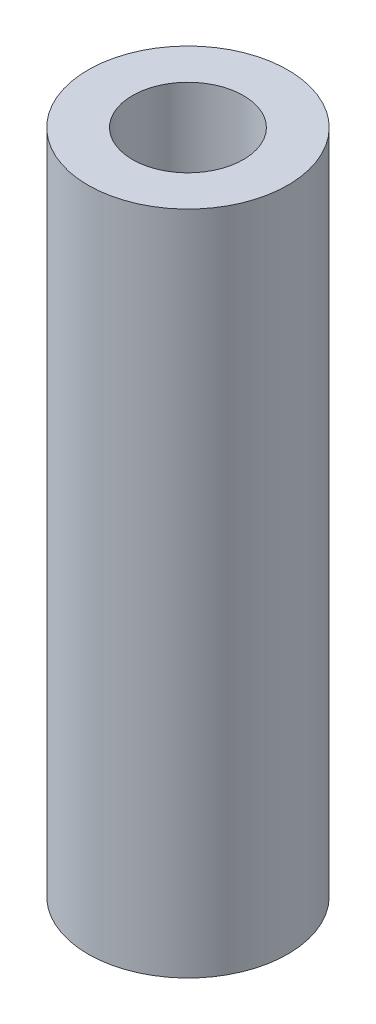
ISO-10303-21;
HEADER;
FILE_DESCRIPTION(('STEP AP214'),'2;1');
FILE_NAME('part.step','',(''),(''),'','','');
FILE_SCHEMA(('AUTOMOTIVE_DESIGN { 1 0 10303 214 1 1 1 1 }'));
ENDSEC;
DATA;
#1=APPLICATION_CONTEXT('core data for automotive mechanical design processes');
#2=APPLICATION_PROTOCOL_DEFINITION('international standard','automotive_design',2000,#1);
#3=PRODUCT_CONTEXT('',#1,'mechanical');
#4=PRODUCT('Part','Part','',(#3));
#5=PRODUCT_RELATED_PRODUCT_CATEGORY('part','',(#4));
#6=PRODUCT_DEFINITION_FORMATION('','',#4);
#7=PRODUCT_DEFINITION_CONTEXT('part definition',#1,'design');
#8=PRODUCT_DEFINITION('design','',#6,#7);
#9=PRODUCT_DEFINITION_SHAPE('','',#8);
#10=(LENGTH_UNIT() NAMED_UNIT(*) SI_UNIT(.MILLI.,.METRE.));
#11=(NAMED_UNIT(*) PLANE_ANGLE_UNIT() SI_UNIT($,.RADIAN.));
#12=(NAMED_UNIT(*) SI_UNIT($,.STERADIAN.) SOLID_ANGLE_UNIT());
#13=UNCERTAINTY_MEASURE_WITH_UNIT(LENGTH_MEASURE(1.E-05),#10,'distance_accuracy_value','');
#14=(GEOMETRIC_REPRESENTATION_CONTEXT(3) GLOBAL_UNCERTAINTY_ASSIGNED_CONTEXT((#13)) GLOBAL_UNIT_ASSIGNED_CONTEXT((#10,
#11,#12)) REPRESENTATION_CONTEXT('',''));
#15=CARTESIAN_POINT('',(0.,0.,0.));
#16=DIRECTION('',(0.,0.,1.));
#17=DIRECTION('',(1.,0.,0.));
#18=AXIS2_PLACEMENT_3D('',#15,#16,#17);
#19=CARTESIAN_POINT('',(0.,15.,0.));
#20=DIRECTION('',(0.,1.,0.));
#21=DIRECTION('',(0.,0.,1.));
#22=AXIS2_PLACEMENT_3D('',#19,#20,#21);
#23=PLANE('',#22);
#24=CARTESIAN_POINT('',(0.,15.,0.));
#25=DIRECTION('',(0.,1.,0.));
#26=DIRECTION('',(0.,0.,1.));
#27=AXIS2_PLACEMENT_3D('',#24,#25,#26);
#28=CIRCLE('',#27,2.25);
#29=CARTESIAN_POINT('',(0.,15.,2.25));
#30=VERTEX_POINT('',#29);
#31=EDGE_CURVE('E10',#30,#30,#28,.T.);
#32=ORIENTED_EDGE('',*,*,#31,.T.);
#33=EDGE_LOOP('',(#32));
#34=FACE_BOUND('',#33,.T.);
#35=CARTESIAN_POINT('',(0.,15.,0.));
#36=DIRECTION('',(0.,1.,0.));
#37=DIRECTION('',(0.,0.,1.));
#38=AXIS2_PLACEMENT_3D('',#35,#36,#37);
#39=CIRCLE('',#38,1.25);
#40=CARTESIAN_POINT('',(0.,15.,1.25));
#41=VERTEX_POINT('',#40);
#42=EDGE_CURVE('E42',#41,#41,#39,.T.);
#43=ORIENTED_EDGE('',*,*,#42,.F.);
#44=EDGE_LOOP('',(#43));
#45=FACE_BOUND('',#44,.T.);
#46=ADVANCED_FACE('F31',(#34,#45),#23,.T.);
#47=CARTESIAN_POINT('',(0.,0.,0.));
#48=DIRECTION('',(0.,1.,0.));
#49=DIRECTION('',(0.,0.,1.));
#50=AXIS2_PLACEMENT_3D('',#47,#48,#49);
#51=PLANE('',#50);
#52=CARTESIAN_POINT('',(0.,0.,0.));
#53=DIRECTION('',(0.,1.,0.));
#54=DIRECTION('',(0.,0.,1.));
#55=AXIS2_PLACEMENT_3D('',#52,#53,#54);
#56=CIRCLE('',#55,2.25);
#57=CARTESIAN_POINT('',(0.,0.,2.25));
#58=VERTEX_POINT('',#57);
#59=EDGE_CURVE('E35',#58,#58,#56,.T.);
#60=ORIENTED_EDGE('',*,*,#59,.F.);
#61=EDGE_LOOP('',(#60));
#62=FACE_BOUND('',#61,.T.);
#63=CARTESIAN_POINT('',(0.,0.,0.));
#64=DIRECTION('',(0.,1.,0.));
#65=DIRECTION('',(0.,0.,1.));
#66=AXIS2_PLACEMENT_3D('',#63,#64,#65);
#67=CIRCLE('',#66,1.25);
#68=CARTESIAN_POINT('',(0.,0.,1.25));
#69=VERTEX_POINT('',#68);
#70=EDGE_CURVE('E44',#69,#69,#67,.T.);
#71=ORIENTED_EDGE('',*,*,#70,.T.);
#72=EDGE_LOOP('',(#71));
#73=FACE_BOUND('',#72,.T.);
#74=ADVANCED_FACE('F54',(#62,#73),#51,.F.);
#75=CARTESIAN_POINT('',(0.,15.,0.));
#76=DIRECTION('',(0.,-1.,0.));
#77=DIRECTION('',(0.,0.,-1.));
#78=AXIS2_PLACEMENT_3D('',#75,#76,#77);
#79=CYLINDRICAL_SURFACE('',#78,2.25);
#80=ORIENTED_EDGE('',*,*,#31,.F.);
#81=EDGE_LOOP('',(#80));
#82=FACE_BOUND('',#81,.T.);
#83=ORIENTED_EDGE('',*,*,#59,.T.);
#84=EDGE_LOOP('',(#83));
#85=FACE_BOUND('',#84,.T.);
#86=ADVANCED_FACE('F33',(#82,#85),#79,.T.);
#87=CARTESIAN_POINT('',(0.,15.,0.));
#88=DIRECTION('',(0.,-1.,0.));
#89=DIRECTION('',(0.,0.,-1.));
#90=AXIS2_PLACEMENT_3D('',#87,#88,#89);
#91=CYLINDRICAL_SURFACE('',#90,1.25);
#92=ORIENTED_EDGE('',*,*,#42,.T.);
#93=EDGE_LOOP('',(#92));
#94=FACE_BOUND('',#93,.T.);
#95=ORIENTED_EDGE('',*,*,#70,.F.);
#96=EDGE_LOOP('',(#95));
#97=FACE_BOUND('',#96,.T.);
#98=ADVANCED_FACE('F50',(#94,#97),#91,.F.);
#99=CLOSED_SHELL('',(#46,#74,#86,#98));
#100=MANIFOLD_SOLID_BREP('B2',#99);
#101=ADVANCED_BREP_SHAPE_REPRESENTATION('',(#18,#100),#14);
#102=SHAPE_DEFINITION_REPRESENTATION(#9,#101);
ENDSEC;
END-ISO-10303-21;
